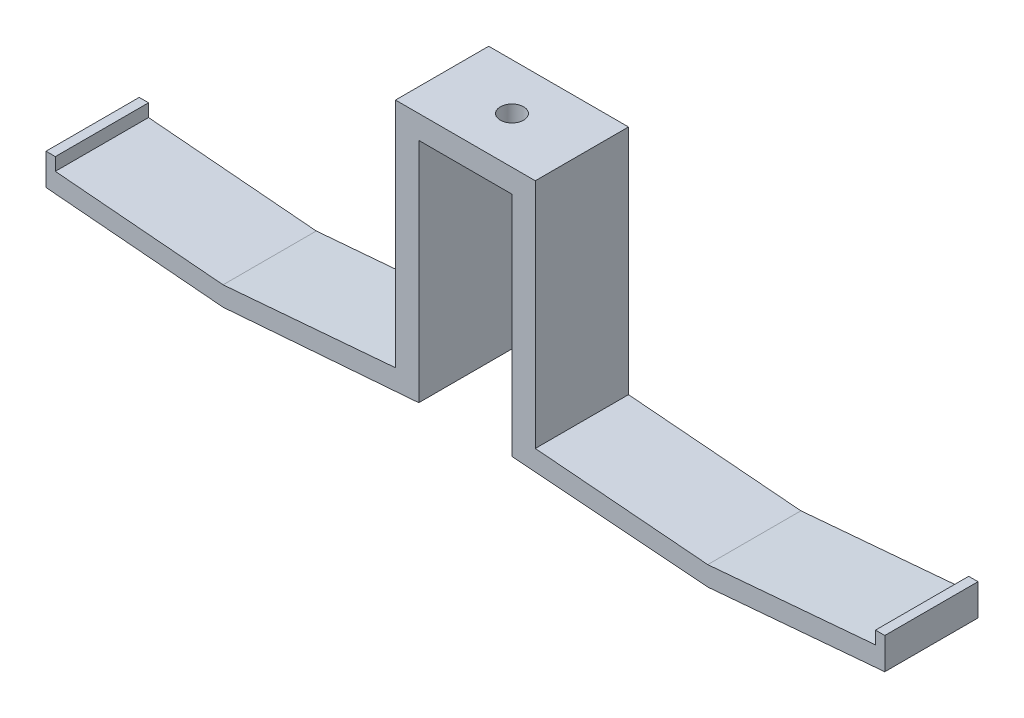
ISO-10303-21;
HEADER;
FILE_DESCRIPTION(('STEP AP214'),'2;1');
FILE_NAME('part.step','',(''),(''),'','','');
FILE_SCHEMA(('AUTOMOTIVE_DESIGN { 1 0 10303 214 1 1 1 1 }'));
ENDSEC;
DATA;
#1=APPLICATION_CONTEXT('core data for automotive mechanical design processes');
#2=APPLICATION_PROTOCOL_DEFINITION('international standard','automotive_design',2000,#1);
#3=PRODUCT_CONTEXT('',#1,'mechanical');
#4=PRODUCT('Part','Part','',(#3));
#5=PRODUCT_RELATED_PRODUCT_CATEGORY('part','',(#4));
#6=PRODUCT_DEFINITION_FORMATION('','',#4);
#7=PRODUCT_DEFINITION_CONTEXT('part definition',#1,'design');
#8=PRODUCT_DEFINITION('design','',#6,#7);
#9=PRODUCT_DEFINITION_SHAPE('','',#8);
#10=(LENGTH_UNIT() NAMED_UNIT(*) SI_UNIT(.MILLI.,.METRE.));
#11=(NAMED_UNIT(*) PLANE_ANGLE_UNIT() SI_UNIT($,.RADIAN.));
#12=(NAMED_UNIT(*) SI_UNIT($,.STERADIAN.) SOLID_ANGLE_UNIT());
#13=UNCERTAINTY_MEASURE_WITH_UNIT(LENGTH_MEASURE(1.E-05),#10,'distance_accuracy_value','');
#14=(GEOMETRIC_REPRESENTATION_CONTEXT(3) GLOBAL_UNCERTAINTY_ASSIGNED_CONTEXT((#13)) GLOBAL_UNIT_ASSIGNED_CONTEXT((#10,
#11,#12)) REPRESENTATION_CONTEXT('',''));
#15=CARTESIAN_POINT('',(0.,0.,0.));
#16=DIRECTION('',(0.,0.,1.));
#17=DIRECTION('',(1.,0.,0.));
#18=AXIS2_PLACEMENT_3D('',#15,#16,#17);
#19=CARTESIAN_POINT('',(-4.57245309052163,-54.8694358998936,25.4));
#20=DIRECTION('',(0.0830454816369344,0.99654575809628,0.));
#21=DIRECTION('',(-0.99654575809628,0.0830454816369344,0.));
#22=AXIS2_PLACEMENT_3D('',#19,#20,#21);
#23=PLANE('',#22);
#24=DIRECTION('',(0.99654575809628,-0.0830454816369344,0.));
#25=VECTOR('',#24,1.);
#26=CARTESIAN_POINT('',(-4.57245309052163,-54.8694358998936,0.));
#27=LINE('',#26,#25);
#28=CARTESIAN_POINT('',(19.05,-56.8379737,0.));
#29=VERTEX_POINT('',#28);
#30=CARTESIAN_POINT('',(66.04,-60.753807118,0.));
#31=VERTEX_POINT('',#30);
#32=EDGE_CURVE('E202',#29,#31,#27,.T.);
#33=ORIENTED_EDGE('',*,*,#32,.F.);
#34=DIRECTION('',(0.,0.,-1.));
#35=VECTOR('',#34,1.);
#36=CARTESIAN_POINT('',(19.05,-56.8379737,25.4));
#37=LINE('',#36,#35);
#38=CARTESIAN_POINT('',(19.05,-56.8379737,25.4));
#39=VERTEX_POINT('',#38);
#40=EDGE_CURVE('E11',#39,#29,#37,.T.);
#41=ORIENTED_EDGE('',*,*,#40,.F.);
#42=DIRECTION('',(0.99654575809628,-0.0830454816369344,0.));
#43=VECTOR('',#42,1.);
#44=CARTESIAN_POINT('',(-4.57245309052163,-54.8694358998936,25.4));
#45=LINE('',#44,#43);
#46=CARTESIAN_POINT('',(66.04,-60.753807118,25.4));
#47=VERTEX_POINT('',#46);
#48=EDGE_CURVE('E252',#39,#47,#45,.T.);
#49=ORIENTED_EDGE('',*,*,#48,.T.);
#50=DIRECTION('',(0.,0.,-1.));
#51=VECTOR('',#50,1.);
#52=CARTESIAN_POINT('',(66.04,-60.753807118,25.4));
#53=LINE('',#52,#51);
#54=EDGE_CURVE('E125',#47,#31,#53,.T.);
#55=ORIENTED_EDGE('',*,*,#54,.T.);
#56=EDGE_LOOP('',(#33,#41,#49,#55));
#57=FACE_BOUND('',#56,.T.);
#58=ADVANCED_FACE('F38',(#57),#23,.T.);
#59=CARTESIAN_POINT('',(19.05,0.,25.4));
#60=DIRECTION('',(1.,0.,0.));
#61=DIRECTION('',(0.,1.,0.));
#62=AXIS2_PLACEMENT_3D('',#59,#60,#61);
#63=PLANE('',#62);
#64=DIRECTION('',(0.,-1.,0.));
#65=VECTOR('',#64,1.);
#66=CARTESIAN_POINT('',(19.05,0.,0.));
#67=LINE('',#66,#65);
#68=CARTESIAN_POINT('',(19.05,6.34999999999999,0.));
#69=VERTEX_POINT('',#68);
#70=EDGE_CURVE('E205',#69,#29,#67,.T.);
#71=ORIENTED_EDGE('',*,*,#70,.F.);
#72=DIRECTION('',(0.,0.,-1.));
#73=VECTOR('',#72,1.);
#74=CARTESIAN_POINT('',(19.05,6.34999999999999,25.4));
#75=LINE('',#74,#73);
#76=CARTESIAN_POINT('',(19.05,6.34999999999999,25.4));
#77=VERTEX_POINT('',#76);
#78=EDGE_CURVE('E46',#77,#69,#75,.T.);
#79=ORIENTED_EDGE('',*,*,#78,.F.);
#80=DIRECTION('',(0.,-1.,0.));
#81=VECTOR('',#80,1.);
#82=CARTESIAN_POINT('',(19.05,0.,25.4));
#83=LINE('',#82,#81);
#84=EDGE_CURVE('E303',#77,#39,#83,.T.);
#85=ORIENTED_EDGE('',*,*,#84,.T.);
#86=ORIENTED_EDGE('',*,*,#40,.T.);
#87=EDGE_LOOP('',(#71,#79,#85,#86));
#88=FACE_BOUND('',#87,.T.);
#89=ADVANCED_FACE('F302',(#88),#63,.T.);
#90=CARTESIAN_POINT('',(0.,6.34999999999999,25.4));
#91=DIRECTION('',(0.,-1.,0.));
#92=DIRECTION('',(0.,0.,-1.));
#93=AXIS2_PLACEMENT_3D('',#90,#91,#92);
#94=PLANE('',#93);
#95=CARTESIAN_POINT('',(0.,6.34999999999999,12.7));
#96=DIRECTION('',(0.,1.,0.));
#97=DIRECTION('',(0.,0.,1.));
#98=AXIS2_PLACEMENT_3D('',#95,#96,#97);
#99=CIRCLE('',#98,3.175);
#100=CARTESIAN_POINT('',(0.,6.34999999999999,15.875));
#101=VERTEX_POINT('',#100);
#102=EDGE_CURVE('E206',#101,#101,#99,.T.);
#103=ORIENTED_EDGE('',*,*,#102,.F.);
#104=EDGE_LOOP('',(#103));
#105=FACE_BOUND('',#104,.T.);
#106=DIRECTION('',(-1.,0.,0.));
#107=VECTOR('',#106,1.);
#108=CARTESIAN_POINT('',(0.,6.34999999999999,0.));
#109=LINE('',#108,#107);
#110=CARTESIAN_POINT('',(-19.05,6.34999999999999,0.));
#111=VERTEX_POINT('',#110);
#112=EDGE_CURVE('E209',#69,#111,#109,.T.);
#113=ORIENTED_EDGE('',*,*,#112,.T.);
#114=DIRECTION('',(0.,0.,-1.));
#115=VECTOR('',#114,1.);
#116=CARTESIAN_POINT('',(-19.05,6.34999999999999,25.4));
#117=LINE('',#116,#115);
#118=CARTESIAN_POINT('',(-19.05,6.34999999999999,25.4));
#119=VERTEX_POINT('',#118);
#120=EDGE_CURVE('E286',#119,#111,#117,.T.);
#121=ORIENTED_EDGE('',*,*,#120,.F.);
#122=DIRECTION('',(-1.,0.,0.));
#123=VECTOR('',#122,1.);
#124=CARTESIAN_POINT('',(0.,6.34999999999999,25.4));
#125=LINE('',#124,#123);
#126=EDGE_CURVE('E293',#77,#119,#125,.T.);
#127=ORIENTED_EDGE('',*,*,#126,.F.);
#128=ORIENTED_EDGE('',*,*,#78,.T.);
#129=EDGE_LOOP('',(#113,#121,#127,#128));
#130=FACE_BOUND('',#129,.T.);
#131=ADVANCED_FACE('F291',(#105,#130),#94,.F.);
#132=CARTESIAN_POINT('',(-19.05,0.,25.4));
#133=DIRECTION('',(1.,0.,0.));
#134=DIRECTION('',(0.,1.,0.));
#135=AXIS2_PLACEMENT_3D('',#132,#133,#134);
#136=PLANE('',#135);
#137=DIRECTION('',(0.,-1.,0.));
#138=VECTOR('',#137,1.);
#139=CARTESIAN_POINT('',(-19.05,0.,0.));
#140=LINE('',#139,#138);
#141=CARTESIAN_POINT('',(-19.05,-56.8379737,0.));
#142=VERTEX_POINT('',#141);
#143=EDGE_CURVE('E211',#111,#142,#140,.T.);
#144=ORIENTED_EDGE('',*,*,#143,.T.);
#145=DIRECTION('',(0.,0.,-1.));
#146=VECTOR('',#145,1.);
#147=CARTESIAN_POINT('',(-19.05,-56.8379737,25.4));
#148=LINE('',#147,#146);
#149=CARTESIAN_POINT('',(-19.05,-56.8379737,25.4));
#150=VERTEX_POINT('',#149);
#151=EDGE_CURVE('E283',#150,#142,#148,.T.);
#152=ORIENTED_EDGE('',*,*,#151,.F.);
#153=DIRECTION('',(0.,-1.,0.));
#154=VECTOR('',#153,1.);
#155=CARTESIAN_POINT('',(-19.05,0.,25.4));
#156=LINE('',#155,#154);
#157=EDGE_CURVE('E314',#119,#150,#156,.T.);
#158=ORIENTED_EDGE('',*,*,#157,.F.);
#159=ORIENTED_EDGE('',*,*,#120,.T.);
#160=EDGE_LOOP('',(#144,#152,#158,#159));
#161=FACE_BOUND('',#160,.T.);
#162=ADVANCED_FACE('F404',(#161),#136,.F.);
#163=CARTESIAN_POINT('',(4.57245309052164,-54.8694358998936,25.4));
#164=DIRECTION('',(0.0830454816369345,-0.99654575809628,0.));
#165=DIRECTION('',(0.99654575809628,0.0830454816369345,0.));
#166=AXIS2_PLACEMENT_3D('',#163,#164,#165);
#167=PLANE('',#166);
#168=DIRECTION('',(-0.99654575809628,-0.0830454816369345,0.));
#169=VECTOR('',#168,1.);
#170=CARTESIAN_POINT('',(4.57245309052164,-54.8694358998936,0.));
#171=LINE('',#170,#169);
#172=CARTESIAN_POINT('',(-66.04,-60.753807118,0.));
#173=VERTEX_POINT('',#172);
#174=EDGE_CURVE('E213',#142,#173,#171,.T.);
#175=ORIENTED_EDGE('',*,*,#174,.T.);
#176=DIRECTION('',(0.,0.,-1.));
#177=VECTOR('',#176,1.);
#178=CARTESIAN_POINT('',(-66.04,-60.753807118,25.4));
#179=LINE('',#178,#177);
#180=CARTESIAN_POINT('',(-66.04,-60.753807118,25.4));
#181=VERTEX_POINT('',#180);
#182=EDGE_CURVE('E281',#181,#173,#179,.T.);
#183=ORIENTED_EDGE('',*,*,#182,.F.);
#184=DIRECTION('',(-0.99654575809628,-0.0830454816369345,0.));
#185=VECTOR('',#184,1.);
#186=CARTESIAN_POINT('',(4.57245309052164,-54.8694358998936,25.4));
#187=LINE('',#186,#185);
#188=EDGE_CURVE('E316',#150,#181,#187,.T.);
#189=ORIENTED_EDGE('',*,*,#188,.F.);
#190=ORIENTED_EDGE('',*,*,#151,.T.);
#191=EDGE_LOOP('',(#175,#183,#189,#190));
#192=FACE_BOUND('',#191,.T.);
#193=ADVANCED_FACE('F400',(#192),#167,.F.);
#194=CARTESIAN_POINT('',(-5.64647427056283,-65.9264008687037,25.4));
#195=DIRECTION('',(0.0853357272861369,0.996352253798096,0.));
#196=DIRECTION('',(-0.996352253798096,0.0853357272861369,0.));
#197=AXIS2_PLACEMENT_3D('',#194,#195,#196);
#198=PLANE('',#197);
#199=DIRECTION('',(0.996352253798096,-0.0853357272861369,0.));
#200=VECTOR('',#199,1.);
#201=CARTESIAN_POINT('',(-5.64647427056283,-65.9264008687037,0.));
#202=LINE('',#201,#200);
#203=CARTESIAN_POINT('',(-111.76,-56.8379737,0.));
#204=VERTEX_POINT('',#203);
#205=EDGE_CURVE('E216',#204,#173,#202,.T.);
#206=ORIENTED_EDGE('',*,*,#205,.F.);
#207=DIRECTION('',(0.,0.,-1.));
#208=VECTOR('',#207,1.);
#209=CARTESIAN_POINT('',(-111.76,-56.8379737,25.4));
#210=LINE('',#209,#208);
#211=CARTESIAN_POINT('',(-111.76,-56.8379737,25.4));
#212=VERTEX_POINT('',#211);
#213=EDGE_CURVE('E279',#212,#204,#210,.T.);
#214=ORIENTED_EDGE('',*,*,#213,.F.);
#215=DIRECTION('',(0.996352253798096,-0.0853357272861369,0.));
#216=VECTOR('',#215,1.);
#217=CARTESIAN_POINT('',(-5.64647427056283,-65.9264008687037,25.4));
#218=LINE('',#217,#216);
#219=EDGE_CURVE('E318',#212,#181,#218,.T.);
#220=ORIENTED_EDGE('',*,*,#219,.T.);
#221=ORIENTED_EDGE('',*,*,#182,.T.);
#222=EDGE_LOOP('',(#206,#214,#220,#221));
#223=FACE_BOUND('',#222,.T.);
#224=ADVANCED_FACE('F395',(#223),#198,.T.);
#225=CARTESIAN_POINT('',(-111.76,0.,25.4));
#226=DIRECTION('',(1.,0.,0.));
#227=DIRECTION('',(0.,0.,-1.));
#228=AXIS2_PLACEMENT_3D('',#225,#226,#227);
#229=PLANE('',#228);
#230=DIRECTION('',(0.,-1.,0.));
#231=VECTOR('',#230,1.);
#232=CARTESIAN_POINT('',(-111.76,0.,0.));
#233=LINE('',#232,#231);
#234=CARTESIAN_POINT('',(-111.76,-53.351353419,0.));
#235=VERTEX_POINT('',#234);
#236=EDGE_CURVE('E219',#235,#204,#233,.T.);
#237=ORIENTED_EDGE('',*,*,#236,.F.);
#238=DIRECTION('',(0.,0.,-1.));
#239=VECTOR('',#238,1.);
#240=CARTESIAN_POINT('',(-111.76,-53.351353419,25.4));
#241=LINE('',#240,#239);
#242=CARTESIAN_POINT('',(-111.76,-53.351353419,25.4));
#243=VERTEX_POINT('',#242);
#244=EDGE_CURVE('E277',#243,#235,#241,.T.);
#245=ORIENTED_EDGE('',*,*,#244,.F.);
#246=DIRECTION('',(0.,-1.,0.));
#247=VECTOR('',#246,1.);
#248=CARTESIAN_POINT('',(-111.76,0.,25.4));
#249=LINE('',#248,#247);
#250=EDGE_CURVE('E321',#243,#212,#249,.T.);
#251=ORIENTED_EDGE('',*,*,#250,.T.);
#252=ORIENTED_EDGE('',*,*,#213,.T.);
#253=EDGE_LOOP('',(#237,#245,#251,#252));
#254=FACE_BOUND('',#253,.T.);
#255=ADVANCED_FACE('F392',(#254),#229,.T.);
#256=CARTESIAN_POINT('',(0.,-53.351353419,25.4));
#257=DIRECTION('',(0.,1.,0.));
#258=DIRECTION('',(0.,0.,1.));
#259=AXIS2_PLACEMENT_3D('',#256,#257,#258);
#260=PLANE('',#259);
#261=DIRECTION('',(1.,0.,0.));
#262=VECTOR('',#261,1.);
#263=CARTESIAN_POINT('',(0.,-53.351353419,0.));
#264=LINE('',#263,#262);
#265=CARTESIAN_POINT('',(-114.3,-53.351353419,0.));
#266=VERTEX_POINT('',#265);
#267=EDGE_CURVE('E222',#266,#235,#264,.T.);
#268=ORIENTED_EDGE('',*,*,#267,.F.);
#269=DIRECTION('',(0.,0.,-1.));
#270=VECTOR('',#269,1.);
#271=CARTESIAN_POINT('',(-114.3,-53.351353419,25.4));
#272=LINE('',#271,#270);
#273=CARTESIAN_POINT('',(-114.3,-53.351353419,25.4));
#274=VERTEX_POINT('',#273);
#275=EDGE_CURVE('E275',#274,#266,#272,.T.);
#276=ORIENTED_EDGE('',*,*,#275,.F.);
#277=DIRECTION('',(1.,0.,0.));
#278=VECTOR('',#277,1.);
#279=CARTESIAN_POINT('',(0.,-53.351353419,25.4));
#280=LINE('',#279,#278);
#281=EDGE_CURVE('E324',#274,#243,#280,.T.);
#282=ORIENTED_EDGE('',*,*,#281,.T.);
#283=ORIENTED_EDGE('',*,*,#244,.T.);
#284=EDGE_LOOP('',(#268,#276,#282,#283));
#285=FACE_BOUND('',#284,.T.);
#286=ADVANCED_FACE('F388',(#285),#260,.T.);
#287=CARTESIAN_POINT('',(-114.3,0.,25.4));
#288=DIRECTION('',(-1.,0.,0.));
#289=DIRECTION('',(0.,0.,1.));
#290=AXIS2_PLACEMENT_3D('',#287,#288,#289);
#291=PLANE('',#290);
#292=DIRECTION('',(0.,1.,0.));
#293=VECTOR('',#292,1.);
#294=CARTESIAN_POINT('',(-114.3,0.,0.));
#295=LINE('',#294,#293);
#296=CARTESIAN_POINT('',(-114.3,-61.9179737,0.));
#297=VERTEX_POINT('',#296);
#298=EDGE_CURVE('E225',#297,#266,#295,.T.);
#299=ORIENTED_EDGE('',*,*,#298,.F.);
#300=DIRECTION('',(0.,0.,-1.));
#301=VECTOR('',#300,1.);
#302=CARTESIAN_POINT('',(-114.3,-61.9179737,25.4));
#303=LINE('',#302,#301);
#304=CARTESIAN_POINT('',(-114.3,-61.9179737,25.4));
#305=VERTEX_POINT('',#304);
#306=EDGE_CURVE('E273',#305,#297,#303,.T.);
#307=ORIENTED_EDGE('',*,*,#306,.F.);
#308=DIRECTION('',(0.,1.,0.));
#309=VECTOR('',#308,1.);
#310=CARTESIAN_POINT('',(-114.3,0.,25.4));
#311=LINE('',#310,#309);
#312=EDGE_CURVE('E327',#305,#274,#311,.T.);
#313=ORIENTED_EDGE('',*,*,#312,.T.);
#314=ORIENTED_EDGE('',*,*,#275,.T.);
#315=EDGE_LOOP('',(#299,#307,#313,#314));
#316=FACE_BOUND('',#315,.T.);
#317=ADVANCED_FACE('F384',(#316),#291,.T.);
#318=CARTESIAN_POINT('',(-6.09689520048762,-71.1853694503343,25.4));
#319=DIRECTION('',(-0.0853357272861369,-0.996352253798096,0.));
#320=DIRECTION('',(0.996352253798096,-0.0853357272861369,0.));
#321=AXIS2_PLACEMENT_3D('',#318,#319,#320);
#322=PLANE('',#321);
#323=DIRECTION('',(-0.996352253798096,0.0853357272861369,0.));
#324=VECTOR('',#323,1.);
#325=CARTESIAN_POINT('',(-6.09689520048762,-71.1853694503343,0.));
#326=LINE('',#325,#324);
#327=CARTESIAN_POINT('',(-66.04,-66.051353419,0.));
#328=VERTEX_POINT('',#327);
#329=EDGE_CURVE('E228',#328,#297,#326,.T.);
#330=ORIENTED_EDGE('',*,*,#329,.F.);
#331=DIRECTION('',(0.,0.,-1.));
#332=VECTOR('',#331,1.);
#333=CARTESIAN_POINT('',(-66.04,-66.051353419,25.4));
#334=LINE('',#333,#332);
#335=CARTESIAN_POINT('',(-66.04,-66.051353419,25.4));
#336=VERTEX_POINT('',#335);
#337=EDGE_CURVE('E271',#336,#328,#334,.T.);
#338=ORIENTED_EDGE('',*,*,#337,.F.);
#339=DIRECTION('',(-0.996352253798096,0.0853357272861369,0.));
#340=VECTOR('',#339,1.);
#341=CARTESIAN_POINT('',(-6.09689520048762,-71.1853694503343,25.4));
#342=LINE('',#341,#340);
#343=EDGE_CURVE('E330',#336,#305,#342,.T.);
#344=ORIENTED_EDGE('',*,*,#343,.T.);
#345=ORIENTED_EDGE('',*,*,#306,.T.);
#346=EDGE_LOOP('',(#330,#338,#344,#345));
#347=FACE_BOUND('',#346,.T.);
#348=ADVANCED_FACE('F380',(#347),#322,.T.);
#349=CARTESIAN_POINT('',(4.69365020857041,-60.5701191628518,25.4));
#350=DIRECTION('',(0.0772595631880117,-0.997011012926135,0.));
#351=DIRECTION('',(0.997011012926135,0.0772595631880117,0.));
#352=AXIS2_PLACEMENT_3D('',#349,#350,#351);
#353=PLANE('',#352);
#354=DIRECTION('',(-0.997011012926135,-0.0772595631880117,0.));
#355=VECTOR('',#354,1.);
#356=CARTESIAN_POINT('',(4.69365020857041,-60.5701191628518,0.));
#357=LINE('',#356,#355);
#358=CARTESIAN_POINT('',(-12.7,-61.9179737,0.));
#359=VERTEX_POINT('',#358);
#360=EDGE_CURVE('E231',#359,#328,#357,.T.);
#361=ORIENTED_EDGE('',*,*,#360,.F.);
#362=DIRECTION('',(0.,0.,-1.));
#363=VECTOR('',#362,1.);
#364=CARTESIAN_POINT('',(-12.7,-61.9179737,25.4));
#365=LINE('',#364,#363);
#366=CARTESIAN_POINT('',(-12.7,-61.9179737,25.4));
#367=VERTEX_POINT('',#366);
#368=EDGE_CURVE('E269',#367,#359,#365,.T.);
#369=ORIENTED_EDGE('',*,*,#368,.F.);
#370=DIRECTION('',(-0.997011012926135,-0.0772595631880117,0.));
#371=VECTOR('',#370,1.);
#372=CARTESIAN_POINT('',(4.69365020857041,-60.5701191628518,25.4));
#373=LINE('',#372,#371);
#374=EDGE_CURVE('E333',#367,#336,#373,.T.);
#375=ORIENTED_EDGE('',*,*,#374,.T.);
#376=ORIENTED_EDGE('',*,*,#337,.T.);
#377=EDGE_LOOP('',(#361,#369,#375,#376));
#378=FACE_BOUND('',#377,.T.);
#379=ADVANCED_FACE('F376',(#378),#353,.T.);
#380=CARTESIAN_POINT('',(-12.7,0.,25.4));
#381=DIRECTION('',(1.,0.,0.));
#382=DIRECTION('',(0.,1.,0.));
#383=AXIS2_PLACEMENT_3D('',#380,#381,#382);
#384=PLANE('',#383);
#385=DIRECTION('',(0.,-1.,0.));
#386=VECTOR('',#385,1.);
#387=CARTESIAN_POINT('',(-12.7,0.,0.));
#388=LINE('',#387,#386);
#389=CARTESIAN_POINT('',(-12.7,0.,0.));
#390=VERTEX_POINT('',#389);
#391=EDGE_CURVE('E234',#390,#359,#388,.T.);
#392=ORIENTED_EDGE('',*,*,#391,.F.);
#393=DIRECTION('',(0.,0.,-1.));
#394=VECTOR('',#393,1.);
#395=CARTESIAN_POINT('',(-12.7,0.,25.4));
#396=LINE('',#395,#394);
#397=CARTESIAN_POINT('',(-12.7,0.,25.4));
#398=VERTEX_POINT('',#397);
#399=EDGE_CURVE('E267',#398,#390,#396,.T.);
#400=ORIENTED_EDGE('',*,*,#399,.F.);
#401=DIRECTION('',(0.,-1.,0.));
#402=VECTOR('',#401,1.);
#403=CARTESIAN_POINT('',(-12.7,0.,25.4));
#404=LINE('',#403,#402);
#405=EDGE_CURVE('E336',#398,#367,#404,.T.);
#406=ORIENTED_EDGE('',*,*,#405,.T.);
#407=ORIENTED_EDGE('',*,*,#368,.T.);
#408=EDGE_LOOP('',(#392,#400,#406,#407));
#409=FACE_BOUND('',#408,.T.);
#410=ADVANCED_FACE('F372',(#409),#384,.T.);
#411=CARTESIAN_POINT('',(0.,0.,25.4));
#412=DIRECTION('',(0.,-1.,0.));
#413=DIRECTION('',(0.,0.,-1.));
#414=AXIS2_PLACEMENT_3D('',#411,#412,#413);
#415=PLANE('',#414);
#416=CARTESIAN_POINT('',(0.,0.,12.7));
#417=DIRECTION('',(0.,-1.,0.));
#418=DIRECTION('',(0.,0.,-1.));
#419=AXIS2_PLACEMENT_3D('',#416,#417,#418);
#420=CIRCLE('',#419,3.175);
#421=CARTESIAN_POINT('',(0.,0.,9.525));
#422=VERTEX_POINT('',#421);
#423=EDGE_CURVE('E310',#422,#422,#420,.F.);
#424=ORIENTED_EDGE('',*,*,#423,.T.);
#425=EDGE_LOOP('',(#424));
#426=FACE_BOUND('',#425,.T.);
#427=DIRECTION('',(-1.,0.,0.));
#428=VECTOR('',#427,1.);
#429=CARTESIAN_POINT('',(0.,0.,0.));
#430=LINE('',#429,#428);
#431=CARTESIAN_POINT('',(12.7,0.,0.));
#432=VERTEX_POINT('',#431);
#433=EDGE_CURVE('E237',#432,#390,#430,.T.);
#434=ORIENTED_EDGE('',*,*,#433,.F.);
#435=DIRECTION('',(0.,0.,-1.));
#436=VECTOR('',#435,1.);
#437=CARTESIAN_POINT('',(12.7,0.,25.4));
#438=LINE('',#437,#436);
#439=CARTESIAN_POINT('',(12.7,0.,25.4));
#440=VERTEX_POINT('',#439);
#441=EDGE_CURVE('E265',#440,#432,#438,.T.);
#442=ORIENTED_EDGE('',*,*,#441,.F.);
#443=DIRECTION('',(-1.,0.,0.));
#444=VECTOR('',#443,1.);
#445=CARTESIAN_POINT('',(0.,0.,25.4));
#446=LINE('',#445,#444);
#447=EDGE_CURVE('E339',#440,#398,#446,.T.);
#448=ORIENTED_EDGE('',*,*,#447,.T.);
#449=ORIENTED_EDGE('',*,*,#399,.T.);
#450=EDGE_LOOP('',(#434,#442,#448,#449));
#451=FACE_BOUND('',#450,.T.);
#452=ADVANCED_FACE('F368',(#426,#451),#415,.T.);
#453=CARTESIAN_POINT('',(12.7,0.,25.4));
#454=DIRECTION('',(1.,0.,0.));
#455=DIRECTION('',(0.,1.,0.));
#456=AXIS2_PLACEMENT_3D('',#453,#454,#455);
#457=PLANE('',#456);
#458=DIRECTION('',(0.,-1.,0.));
#459=VECTOR('',#458,1.);
#460=CARTESIAN_POINT('',(12.7,0.,0.));
#461=LINE('',#460,#459);
#462=CARTESIAN_POINT('',(12.7,-61.9179737,0.));
#463=VERTEX_POINT('',#462);
#464=EDGE_CURVE('E240',#432,#463,#461,.T.);
#465=ORIENTED_EDGE('',*,*,#464,.T.);
#466=DIRECTION('',(0.,0.,-1.));
#467=VECTOR('',#466,1.);
#468=CARTESIAN_POINT('',(12.7,-61.9179737,25.4));
#469=LINE('',#468,#467);
#470=CARTESIAN_POINT('',(12.7,-61.9179737,25.4));
#471=VERTEX_POINT('',#470);
#472=EDGE_CURVE('E262',#471,#463,#469,.T.);
#473=ORIENTED_EDGE('',*,*,#472,.F.);
#474=DIRECTION('',(0.,-1.,0.));
#475=VECTOR('',#474,1.);
#476=CARTESIAN_POINT('',(12.7,0.,25.4));
#477=LINE('',#476,#475);
#478=EDGE_CURVE('E342',#440,#471,#477,.T.);
#479=ORIENTED_EDGE('',*,*,#478,.F.);
#480=ORIENTED_EDGE('',*,*,#441,.T.);
#481=EDGE_LOOP('',(#465,#473,#479,#480));
#482=FACE_BOUND('',#481,.T.);
#483=ADVANCED_FACE('F365',(#482),#457,.F.);
#484=CARTESIAN_POINT('',(-4.69365020857039,-60.5701191628518,25.4));
#485=DIRECTION('',(0.0772595631880114,0.997011012926135,0.));
#486=DIRECTION('',(-0.997011012926135,0.0772595631880114,0.));
#487=AXIS2_PLACEMENT_3D('',#484,#485,#486);
#488=PLANE('',#487);
#489=DIRECTION('',(0.997011012926135,-0.0772595631880114,0.));
#490=VECTOR('',#489,1.);
#491=CARTESIAN_POINT('',(-4.69365020857039,-60.5701191628518,0.));
#492=LINE('',#491,#490);
#493=CARTESIAN_POINT('',(66.04,-66.051353419,0.));
#494=VERTEX_POINT('',#493);
#495=EDGE_CURVE('E242',#463,#494,#492,.T.);
#496=ORIENTED_EDGE('',*,*,#495,.T.);
#497=DIRECTION('',(0.,0.,-1.));
#498=VECTOR('',#497,1.);
#499=CARTESIAN_POINT('',(66.04,-66.051353419,25.4));
#500=LINE('',#499,#498);
#501=CARTESIAN_POINT('',(66.04,-66.051353419,25.4));
#502=VERTEX_POINT('',#501);
#503=EDGE_CURVE('E259',#502,#494,#500,.T.);
#504=ORIENTED_EDGE('',*,*,#503,.F.);
#505=DIRECTION('',(0.997011012926135,-0.0772595631880114,0.));
#506=VECTOR('',#505,1.);
#507=CARTESIAN_POINT('',(-4.69365020857039,-60.5701191628518,25.4));
#508=LINE('',#507,#506);
#509=EDGE_CURVE('E344',#471,#502,#508,.T.);
#510=ORIENTED_EDGE('',*,*,#509,.F.);
#511=ORIENTED_EDGE('',*,*,#472,.T.);
#512=EDGE_LOOP('',(#496,#504,#510,#511));
#513=FACE_BOUND('',#512,.T.);
#514=ADVANCED_FACE('F361',(#513),#488,.F.);
#515=CARTESIAN_POINT('',(6.09689520048764,-71.1853694503343,25.4));
#516=DIRECTION('',(-0.0853357272861372,0.996352253798096,0.));
#517=DIRECTION('',(-0.996352253798096,-0.0853357272861372,0.));
#518=AXIS2_PLACEMENT_3D('',#515,#516,#517);
#519=PLANE('',#518);
#520=DIRECTION('',(0.996352253798096,0.0853357272861372,0.));
#521=VECTOR('',#520,1.);
#522=CARTESIAN_POINT('',(6.09689520048764,-71.1853694503343,0.));
#523=LINE('',#522,#521);
#524=CARTESIAN_POINT('',(114.3,-61.9179737,0.));
#525=VERTEX_POINT('',#524);
#526=EDGE_CURVE('E244',#494,#525,#523,.T.);
#527=ORIENTED_EDGE('',*,*,#526,.T.);
#528=DIRECTION('',(0.,0.,-1.));
#529=VECTOR('',#528,1.);
#530=CARTESIAN_POINT('',(114.3,-61.9179737,25.4));
#531=LINE('',#530,#529);
#532=CARTESIAN_POINT('',(114.3,-61.9179737,25.4));
#533=VERTEX_POINT('',#532);
#534=EDGE_CURVE('E256',#533,#525,#531,.T.);
#535=ORIENTED_EDGE('',*,*,#534,.F.);
#536=DIRECTION('',(0.996352253798096,0.0853357272861372,0.));
#537=VECTOR('',#536,1.);
#538=CARTESIAN_POINT('',(6.09689520048764,-71.1853694503343,25.4));
#539=LINE('',#538,#537);
#540=EDGE_CURVE('E346',#502,#533,#539,.T.);
#541=ORIENTED_EDGE('',*,*,#540,.F.);
#542=ORIENTED_EDGE('',*,*,#503,.T.);
#543=EDGE_LOOP('',(#527,#535,#541,#542));
#544=FACE_BOUND('',#543,.T.);
#545=ADVANCED_FACE('F352',(#544),#519,.F.);
#546=CARTESIAN_POINT('',(114.3,0.,25.4));
#547=DIRECTION('',(-1.,0.,0.));
#548=DIRECTION('',(0.,0.,1.));
#549=AXIS2_PLACEMENT_3D('',#546,#547,#548);
#550=PLANE('',#549);
#551=DIRECTION('',(0.,1.,0.));
#552=VECTOR('',#551,1.);
#553=CARTESIAN_POINT('',(114.3,0.,0.));
#554=LINE('',#553,#552);
#555=CARTESIAN_POINT('',(114.3,-53.351353419,0.));
#556=VERTEX_POINT('',#555);
#557=EDGE_CURVE('E246',#525,#556,#554,.T.);
#558=ORIENTED_EDGE('',*,*,#557,.T.);
#559=DIRECTION('',(0.,0.,-1.));
#560=VECTOR('',#559,1.);
#561=CARTESIAN_POINT('',(114.3,-53.351353419,25.4));
#562=LINE('',#561,#560);
#563=CARTESIAN_POINT('',(114.3,-53.351353419,25.4));
#564=VERTEX_POINT('',#563);
#565=EDGE_CURVE('E194',#564,#556,#562,.T.);
#566=ORIENTED_EDGE('',*,*,#565,.F.);
#567=DIRECTION('',(0.,1.,0.));
#568=VECTOR('',#567,1.);
#569=CARTESIAN_POINT('',(114.3,0.,25.4));
#570=LINE('',#569,#568);
#571=EDGE_CURVE('E185',#533,#564,#570,.T.);
#572=ORIENTED_EDGE('',*,*,#571,.F.);
#573=ORIENTED_EDGE('',*,*,#534,.T.);
#574=EDGE_LOOP('',(#558,#566,#572,#573));
#575=FACE_BOUND('',#574,.T.);
#576=ADVANCED_FACE('F356',(#575),#550,.F.);
#577=CARTESIAN_POINT('',(0.,-53.351353419,25.4));
#578=DIRECTION('',(0.,-1.,0.));
#579=DIRECTION('',(0.,0.,-1.));
#580=AXIS2_PLACEMENT_3D('',#577,#578,#579);
#581=PLANE('',#580);
#582=DIRECTION('',(-1.,0.,0.));
#583=VECTOR('',#582,1.);
#584=CARTESIAN_POINT('',(0.,-53.351353419,0.));
#585=LINE('',#584,#583);
#586=CARTESIAN_POINT('',(111.76,-53.351353419,0.));
#587=VERTEX_POINT('',#586);
#588=EDGE_CURVE('E193',#556,#587,#585,.T.);
#589=ORIENTED_EDGE('',*,*,#588,.T.);
#590=DIRECTION('',(0.,0.,-1.));
#591=VECTOR('',#590,1.);
#592=CARTESIAN_POINT('',(111.76,-53.351353419,25.4));
#593=LINE('',#592,#591);
#594=CARTESIAN_POINT('',(111.76,-53.351353419,25.4));
#595=VERTEX_POINT('',#594);
#596=EDGE_CURVE('E190',#595,#587,#593,.T.);
#597=ORIENTED_EDGE('',*,*,#596,.F.);
#598=DIRECTION('',(-1.,0.,0.));
#599=VECTOR('',#598,1.);
#600=CARTESIAN_POINT('',(0.,-53.351353419,25.4));
#601=LINE('',#600,#599);
#602=EDGE_CURVE('E179',#564,#595,#601,.T.);
#603=ORIENTED_EDGE('',*,*,#602,.F.);
#604=ORIENTED_EDGE('',*,*,#565,.T.);
#605=EDGE_LOOP('',(#589,#597,#603,#604));
#606=FACE_BOUND('',#605,.T.);
#607=ADVANCED_FACE('F191',(#606),#581,.F.);
#608=CARTESIAN_POINT('',(111.76,0.,25.4));
#609=DIRECTION('',(1.,0.,0.));
#610=DIRECTION('',(0.,0.,-1.));
#611=AXIS2_PLACEMENT_3D('',#608,#609,#610);
#612=PLANE('',#611);
#613=DIRECTION('',(0.,-1.,0.));
#614=VECTOR('',#613,1.);
#615=CARTESIAN_POINT('',(111.76,0.,0.));
#616=LINE('',#615,#614);
#617=CARTESIAN_POINT('',(111.76,-56.8379737,0.));
#618=VERTEX_POINT('',#617);
#619=EDGE_CURVE('E118',#587,#618,#616,.T.);
#620=ORIENTED_EDGE('',*,*,#619,.T.);
#621=DIRECTION('',(0.,0.,-1.));
#622=VECTOR('',#621,1.);
#623=CARTESIAN_POINT('',(111.76,-56.8379737,25.4));
#624=LINE('',#623,#622);
#625=CARTESIAN_POINT('',(111.76,-56.8379737,25.4));
#626=VERTEX_POINT('',#625);
#627=EDGE_CURVE('E195',#626,#618,#624,.T.);
#628=ORIENTED_EDGE('',*,*,#627,.F.);
#629=DIRECTION('',(0.,-1.,0.));
#630=VECTOR('',#629,1.);
#631=CARTESIAN_POINT('',(111.76,0.,25.4));
#632=LINE('',#631,#630);
#633=EDGE_CURVE('E183',#595,#626,#632,.T.);
#634=ORIENTED_EDGE('',*,*,#633,.F.);
#635=ORIENTED_EDGE('',*,*,#596,.T.);
#636=EDGE_LOOP('',(#620,#628,#634,#635));
#637=FACE_BOUND('',#636,.T.);
#638=ADVANCED_FACE('F197',(#637),#612,.F.);
#639=CARTESIAN_POINT('',(5.64647427056285,-65.9264008687037,25.4));
#640=DIRECTION('',(0.0853357272861372,-0.996352253798096,0.));
#641=DIRECTION('',(0.996352253798096,0.0853357272861372,0.));
#642=AXIS2_PLACEMENT_3D('',#639,#640,#641);
#643=PLANE('',#642);
#644=DIRECTION('',(-0.996352253798096,-0.0853357272861372,0.));
#645=VECTOR('',#644,1.);
#646=CARTESIAN_POINT('',(5.64647427056285,-65.9264008687037,0.));
#647=LINE('',#646,#645);
#648=EDGE_CURVE('E250',#618,#31,#647,.T.);
#649=ORIENTED_EDGE('',*,*,#648,.T.);
#650=ORIENTED_EDGE('',*,*,#54,.F.);
#651=DIRECTION('',(-0.996352253798096,-0.0853357272861372,0.));
#652=VECTOR('',#651,1.);
#653=CARTESIAN_POINT('',(5.64647427056285,-65.9264008687037,25.4));
#654=LINE('',#653,#652);
#655=EDGE_CURVE('E54',#626,#47,#654,.T.);
#656=ORIENTED_EDGE('',*,*,#655,.F.);
#657=ORIENTED_EDGE('',*,*,#627,.T.);
#658=EDGE_LOOP('',(#649,#650,#656,#657));
#659=FACE_BOUND('',#658,.T.);
#660=ADVANCED_FACE('F306',(#659),#643,.F.);
#661=CARTESIAN_POINT('',(0.,0.,25.4));
#662=DIRECTION('',(0.,0.,1.));
#663=DIRECTION('',(1.,0.,0.));
#664=AXIS2_PLACEMENT_3D('',#661,#662,#663);
#665=PLANE('',#664);
#666=ORIENTED_EDGE('',*,*,#48,.F.);
#667=ORIENTED_EDGE('',*,*,#84,.F.);
#668=ORIENTED_EDGE('',*,*,#126,.T.);
#669=ORIENTED_EDGE('',*,*,#157,.T.);
#670=ORIENTED_EDGE('',*,*,#188,.T.);
#671=ORIENTED_EDGE('',*,*,#219,.F.);
#672=ORIENTED_EDGE('',*,*,#250,.F.);
#673=ORIENTED_EDGE('',*,*,#281,.F.);
#674=ORIENTED_EDGE('',*,*,#312,.F.);
#675=ORIENTED_EDGE('',*,*,#343,.F.);
#676=ORIENTED_EDGE('',*,*,#374,.F.);
#677=ORIENTED_EDGE('',*,*,#405,.F.);
#678=ORIENTED_EDGE('',*,*,#447,.F.);
#679=ORIENTED_EDGE('',*,*,#478,.T.);
#680=ORIENTED_EDGE('',*,*,#509,.T.);
#681=ORIENTED_EDGE('',*,*,#540,.T.);
#682=ORIENTED_EDGE('',*,*,#571,.T.);
#683=ORIENTED_EDGE('',*,*,#602,.T.);
#684=ORIENTED_EDGE('',*,*,#633,.T.);
#685=ORIENTED_EDGE('',*,*,#655,.T.);
#686=EDGE_LOOP('',(#666,#667,#668,#669,#670,#671,#672,#673,#674,#675,#676,#677,#678,#679,#680,
#681,#682,#683,#684,#685));
#687=FACE_BOUND('',#686,.T.);
#688=ADVANCED_FACE('F181',(#687),#665,.T.);
#689=CARTESIAN_POINT('',(0.,0.,0.));
#690=DIRECTION('',(0.,0.,1.));
#691=DIRECTION('',(1.,0.,0.));
#692=AXIS2_PLACEMENT_3D('',#689,#690,#691);
#693=PLANE('',#692);
#694=ORIENTED_EDGE('',*,*,#32,.T.);
#695=ORIENTED_EDGE('',*,*,#648,.F.);
#696=ORIENTED_EDGE('',*,*,#619,.F.);
#697=ORIENTED_EDGE('',*,*,#588,.F.);
#698=ORIENTED_EDGE('',*,*,#557,.F.);
#699=ORIENTED_EDGE('',*,*,#526,.F.);
#700=ORIENTED_EDGE('',*,*,#495,.F.);
#701=ORIENTED_EDGE('',*,*,#464,.F.);
#702=ORIENTED_EDGE('',*,*,#433,.T.);
#703=ORIENTED_EDGE('',*,*,#391,.T.);
#704=ORIENTED_EDGE('',*,*,#360,.T.);
#705=ORIENTED_EDGE('',*,*,#329,.T.);
#706=ORIENTED_EDGE('',*,*,#298,.T.);
#707=ORIENTED_EDGE('',*,*,#267,.T.);
#708=ORIENTED_EDGE('',*,*,#236,.T.);
#709=ORIENTED_EDGE('',*,*,#205,.T.);
#710=ORIENTED_EDGE('',*,*,#174,.F.);
#711=ORIENTED_EDGE('',*,*,#143,.F.);
#712=ORIENTED_EDGE('',*,*,#112,.F.);
#713=ORIENTED_EDGE('',*,*,#70,.T.);
#714=EDGE_LOOP('',(#694,#695,#696,#697,#698,#699,#700,#701,#702,#703,#704,#705,#706,#707,#708,
#709,#710,#711,#712,#713));
#715=FACE_BOUND('',#714,.T.);
#716=ADVANCED_FACE('F300',(#715),#693,.F.);
#717=CARTESIAN_POINT('',(0.,-66.052353419,12.7));
#718=DIRECTION('',(0.,1.,0.));
#719=DIRECTION('',(0.,0.,1.));
#720=AXIS2_PLACEMENT_3D('',#717,#718,#719);
#721=CYLINDRICAL_SURFACE('',#720,3.175);
#722=ORIENTED_EDGE('',*,*,#423,.F.);
#723=EDGE_LOOP('',(#722));
#724=FACE_BOUND('',#723,.T.);
#725=ORIENTED_EDGE('',*,*,#102,.T.);
#726=EDGE_LOOP('',(#725));
#727=FACE_BOUND('',#726,.T.);
#728=ADVANCED_FACE('F448',(#724,#727),#721,.F.);
#729=CLOSED_SHELL('',(#58,#89,#131,#162,#193,#224,#255,#286,#317,#348,#379,#410,#452,#483,#514,
#545,#576,#607,#638,#660,#688,#716,#728));
#730=MANIFOLD_SOLID_BREP('B2',#729);
#731=ADVANCED_BREP_SHAPE_REPRESENTATION('',(#18,#730),#14);
#732=SHAPE_DEFINITION_REPRESENTATION(#9,#731);
ENDSEC;
END-ISO-10303-21;
